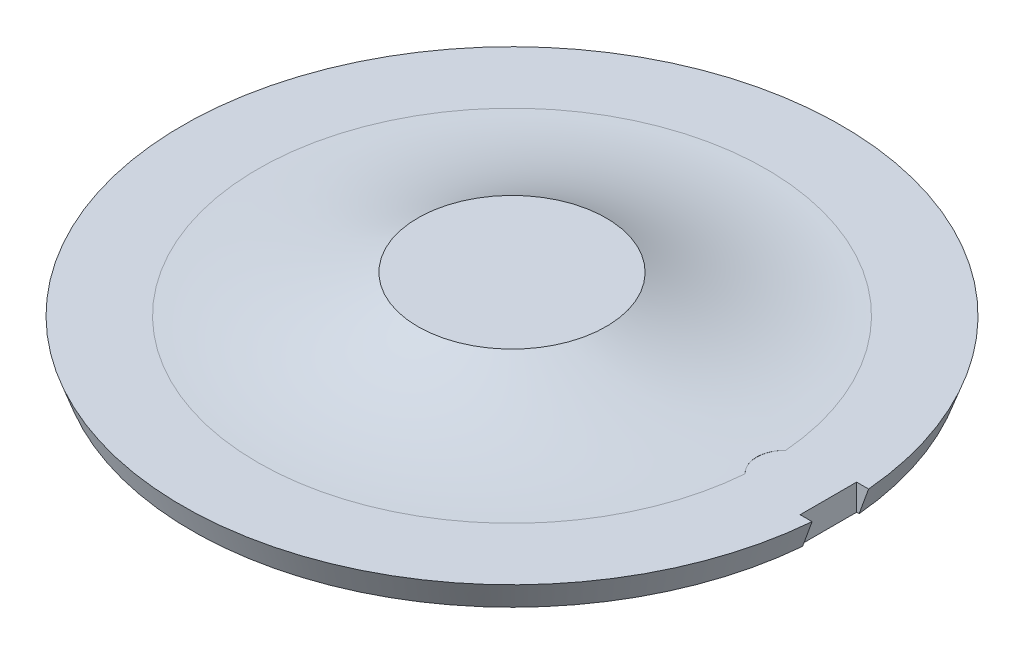
ISO-10303-21;
HEADER;
FILE_DESCRIPTION(('STEP AP214'),'2;1');
FILE_NAME('part.step','',(''),(''),'','','');
FILE_SCHEMA(('AUTOMOTIVE_DESIGN { 1 0 10303 214 1 1 1 1 }'));
ENDSEC;
DATA;
#1=APPLICATION_CONTEXT('core data for automotive mechanical design processes');
#2=APPLICATION_PROTOCOL_DEFINITION('international standard','automotive_design',2000,#1);
#3=PRODUCT_CONTEXT('',#1,'mechanical');
#4=PRODUCT('Part','Part','',(#3));
#5=PRODUCT_RELATED_PRODUCT_CATEGORY('part','',(#4));
#6=PRODUCT_DEFINITION_FORMATION('','',#4);
#7=PRODUCT_DEFINITION_CONTEXT('part definition',#1,'design');
#8=PRODUCT_DEFINITION('design','',#6,#7);
#9=PRODUCT_DEFINITION_SHAPE('','',#8);
#10=(LENGTH_UNIT() NAMED_UNIT(*) SI_UNIT(.MILLI.,.METRE.));
#11=(NAMED_UNIT(*) PLANE_ANGLE_UNIT() SI_UNIT($,.RADIAN.));
#12=(NAMED_UNIT(*) SI_UNIT($,.STERADIAN.) SOLID_ANGLE_UNIT());
#13=UNCERTAINTY_MEASURE_WITH_UNIT(LENGTH_MEASURE(1.E-05),#10,'distance_accuracy_value','');
#14=(GEOMETRIC_REPRESENTATION_CONTEXT(3) GLOBAL_UNCERTAINTY_ASSIGNED_CONTEXT((#13)) GLOBAL_UNIT_ASSIGNED_CONTEXT((#10,
#11,#12)) REPRESENTATION_CONTEXT('',''));
#15=CARTESIAN_POINT('',(0.,0.,0.));
#16=DIRECTION('',(0.,0.,1.));
#17=DIRECTION('',(1.,0.,0.));
#18=AXIS2_PLACEMENT_3D('',#15,#16,#17);
#19=CARTESIAN_POINT('',(0.,-431.799617416666,0.));
#20=DIRECTION('',(0.,1.,0.));
#21=DIRECTION('',(0.,0.,1.));
#22=AXIS2_PLACEMENT_3D('',#19,#20,#21);
#23=DEGENERATE_TOROIDAL_SURFACE('',#22,292.099904354144,431.799617416666,.T.);
#24=CARTESIAN_POINT('',(0.,-50.8,0.));
#25=DIRECTION('',(0.,1.,0.));
#26=DIRECTION('',(0.,0.,1.));
#27=AXIS2_PLACEMENT_3D('',#24,#25,#26);
#28=CIRCLE('',#27,88.9);
#29=CARTESIAN_POINT('',(0.,-50.8,88.9));
#30=VERTEX_POINT('',#29);
#31=EDGE_CURVE('E242',#30,#30,#28,.T.);
#32=ORIENTED_EDGE('',*,*,#31,.T.);
#33=EDGE_LOOP('',(#32));
#34=FACE_BOUND('',#33,.T.);
#35=CARTESIAN_POINT('',(343.153462992408,-3.28509972895805,38.1));
#36=CARTESIAN_POINT('',(338.701467969945,-2.73612243698974,38.1));
#37=CARTESIAN_POINT('',(334.241005320827,-2.2558780770424,38.1));
#38=CARTESIAN_POINT('',(325.307426552279,-1.43299467295321,38.1));
#39=CARTESIAN_POINT('',(320.834310497118,-1.09035493115061,38.1));
#40=CARTESIAN_POINT('',(311.896316504674,-0.54383303313131,38.1));
#41=CARTESIAN_POINT('',(307.431469818942,-0.339439458884335,38.1));
#42=CARTESIAN_POINT('',(298.497618278462,-0.067295956164065,38.1));
#43=CARTESIAN_POINT('',(294.028613425756,0.00045403939327902,38.1));
#44=CARTESIAN_POINT('',(285.090781160922,-0.000458601069057031,38.1));
#45=CARTESIAN_POINT('',(280.621953748168,-0.0691163540137956,38.1));
#46=CARTESIAN_POINT('',(271.688450372767,-0.342417936377009,38.1));
#47=CARTESIAN_POINT('',(267.22377442164,-0.547062142041295,38.1));
#48=CARTESIAN_POINT('',(258.286030273747,-1.09276553446646,38.1));
#49=CARTESIAN_POINT('',(253.812993037128,-1.43433149496253,38.1));
#50=CARTESIAN_POINT('',(244.879366844338,-2.25301253782263,38.1));
#51=CARTESIAN_POINT('',(240.418777808328,-2.73012674880408,38.1));
#52=CARTESIAN_POINT('',(235.966441361736,-3.27458630595173,38.1));
#53=B_SPLINE_CURVE_WITH_KNOTS('',3,(#35,#36,#37,#38,#39,#40,#41,#42,#43,#44,#45,#46,#47,#48,#49,
#50,#51,#52),.UNSPECIFIED.,.F.,.F.,(4,2,2,2,2,2,2,2,4),(0.,13.4565994474141,26.9131306684868,
40.3196054312072,53.7260736121267,67.1320618818241,80.5380872432158,93.9941958980604,
107.450218051209),.UNSPECIFIED.);
#54=CARTESIAN_POINT('',(289.604461505171,0.,38.1));
#55=VERTEX_POINT('',#54);
#56=CARTESIAN_POINT('',(287.02,-0.00760173721241902,38.1));
#57=VERTEX_POINT('',#56);
#58=EDGE_CURVE('E11',#55,#57,#53,.T.);
#59=ORIENTED_EDGE('',*,*,#58,.F.);
#60=CARTESIAN_POINT('',(0.,0.,0.));
#61=DIRECTION('',(0.,1.,0.));
#62=DIRECTION('',(0.,0.,1.));
#63=AXIS2_PLACEMENT_3D('',#60,#61,#62);
#64=CIRCLE('',#63,292.099904354144);
#65=CARTESIAN_POINT('',(289.604461505171,0.,-38.1));
#66=VERTEX_POINT('',#65);
#67=EDGE_CURVE('E121',#66,#55,#64,.T.);
#68=ORIENTED_EDGE('',*,*,#67,.F.);
#69=CARTESIAN_POINT('',(235.966441361736,-3.27458630595175,-38.1));
#70=CARTESIAN_POINT('',(240.418777808328,-2.73012674880411,-38.1));
#71=CARTESIAN_POINT('',(244.879366844338,-2.25301253782264,-38.1));
#72=CARTESIAN_POINT('',(253.812993037128,-1.4343314949625,-38.1));
#73=CARTESIAN_POINT('',(258.286030273747,-1.09276553446643,-38.1));
#74=CARTESIAN_POINT('',(267.22377442164,-0.547062142041286,-38.1));
#75=CARTESIAN_POINT('',(271.688450372767,-0.342417936377036,-38.1));
#76=CARTESIAN_POINT('',(280.621953748168,-0.0691163540138175,-38.1));
#77=CARTESIAN_POINT('',(285.090781160922,-0.000458601069039103,-38.1));
#78=CARTESIAN_POINT('',(294.028613425756,0.00045403939332354,-38.1));
#79=CARTESIAN_POINT('',(298.497618278462,-0.0672959561640331,-38.1));
#80=CARTESIAN_POINT('',(307.431469818942,-0.339439458884317,-38.1));
#81=CARTESIAN_POINT('',(311.896316504674,-0.543833033131294,-38.1));
#82=CARTESIAN_POINT('',(320.834310497118,-1.0903549311506,-38.1));
#83=CARTESIAN_POINT('',(325.307426552279,-1.43299467295321,-38.1));
#84=CARTESIAN_POINT('',(334.241005320827,-2.25587807704242,-38.1));
#85=CARTESIAN_POINT('',(338.701467969945,-2.73612243698976,-38.1));
#86=CARTESIAN_POINT('',(343.153462992408,-3.28509972895809,-38.1));
#87=B_SPLINE_CURVE_WITH_KNOTS('',3,(#69,#70,#71,#72,#73,#74,#75,#76,#77,#78,#79,#80,#81,#82,#83,
#84,#85,#86),.UNSPECIFIED.,.F.,.F.,(4,2,2,2,2,2,2,2,4),(0.,13.456022153149,26.9121308079936,
40.3181561693852,53.7241444390827,67.1306126200021,80.5370873827225,93.9936186037953,
107.450218051209),.UNSPECIFIED.);
#88=CARTESIAN_POINT('',(287.02,-0.00760173721248147,-38.1));
#89=VERTEX_POINT('',#88);
#90=EDGE_CURVE('E192',#89,#66,#87,.T.);
#91=ORIENTED_EDGE('',*,*,#90,.F.);
#92=CARTESIAN_POINT('',(287.0202,-0.00760056080961184,38.0999999994751));
#93=CARTESIAN_POINT('',(286.48551485532,-0.0107441003588245,38.1000035838872));
#94=CARTESIAN_POINT('',(285.950895137473,-0.0148748883079851,38.0887488058366));
#95=CARTESIAN_POINT('',(284.882634631054,-0.0251242691452786,38.0437577117675));
#96=CARTESIAN_POINT('',(284.348993819012,-0.031242813733873,38.0100219419828));
#97=CARTESIAN_POINT('',(282.751062580791,-0.0525964717974353,37.8751695568477));
#98=CARTESIAN_POINT('',(281.689471607957,-0.0708313051753749,37.7404078263647));
#99=CARTESIAN_POINT('',(279.582485682996,-0.115170537555716,37.3822724124333));
#100=CARTESIAN_POINT('',(278.537077157115,-0.141267918099529,37.1589777015077));
#101=CARTESIAN_POINT('',(276.986243981392,-0.186042734668606,36.758930597817));
#102=CARTESIAN_POINT('',(276.472158009328,-0.201906592928936,36.6147231991849));
#103=CARTESIAN_POINT('',(275.450421191637,-0.235448216459894,36.3048194297707));
#104=CARTESIAN_POINT('',(274.942772017015,-0.253126442334039,36.1391175994841));
#105=CARTESIAN_POINT('',(273.430815397182,-0.308771695282392,35.610168239769));
#106=CARTESIAN_POINT('',(272.437551950085,-0.349347755150277,35.2150905451208));
#107=CARTESIAN_POINT('',(270.487945247207,-0.436640000420907,34.3429982392917));
#108=CARTESIAN_POINT('',(269.531602124991,-0.483356208034014,33.8659833317226));
#109=CARTESIAN_POINT('',(268.130017960203,-0.557244580522501,33.0917476318044));
#110=CARTESIAN_POINT('',(267.668263976677,-0.582512624914469,32.8238516769617));
#111=CARTESIAN_POINT('',(266.756553413389,-0.634169270013296,32.2689843869327));
#112=CARTESIAN_POINT('',(266.306593840746,-0.660557581906963,31.9820179575976));
#113=CARTESIAN_POINT('',(265.41912396996,-0.71430432662279,31.3894387307748));
#114=CARTESIAN_POINT('',(264.981614820898,-0.741662848468103,31.0838242203393));
#115=CARTESIAN_POINT('',(264.11984579738,-0.797177814697518,30.4545189345757));
#116=CARTESIAN_POINT('',(263.695586819114,-0.825334312809007,30.1308269406677));
#117=CARTESIAN_POINT('',(262.441595721329,-0.910887134604656,29.1316994401829));
#118=CARTESIAN_POINT('',(261.632846844378,-0.969232454361403,28.4296797161056));
#119=CARTESIAN_POINT('',(260.077430809286,-1.08687858068017,26.9602124950047));
#120=CARTESIAN_POINT('',(259.33076387247,-1.14617939064769,26.1927647647451));
#121=CARTESIAN_POINT('',(257.904479429744,-1.2641246286467,24.5975848744863));
#122=CARTESIAN_POINT('',(257.224872771902,-1.32276894912471,23.7698429984692));
#123=CARTESIAN_POINT('',(255.937667045053,-1.437717081683,22.0600036264293));
#124=CARTESIAN_POINT('',(255.330068014798,-1.49402089250367,21.1779061011541));
#125=CARTESIAN_POINT('',(254.189757654903,-1.60276492643469,19.3632718694997));
#126=CARTESIAN_POINT('',(253.657235518418,-1.6551952356661,18.430615656104));
#127=CARTESIAN_POINT('',(252.672694957362,-1.75444024585777,16.5234468406268));
#128=CARTESIAN_POINT('',(252.220676707998,-1.80125493459621,15.5489341474551));
#129=CARTESIAN_POINT('',(251.400459987005,-1.88780173522251,13.5650434379355));
#130=CARTESIAN_POINT('',(251.032254119941,-1.92753447194038,12.5556685068205));
#131=CARTESIAN_POINT('',(250.382313621859,-1.99865347864455,10.509165967111));
#132=CARTESIAN_POINT('',(250.100578595434,-2.03003978679664,9.47203848544467));
#133=CARTESIAN_POINT('',(249.626617612577,-2.08333920850104,7.38166173292551));
#134=CARTESIAN_POINT('',(249.434037613108,-2.10528976703059,6.32849368729791));
#135=CARTESIAN_POINT('',(249.138154310253,-2.13918277881166,4.20953004145422));
#136=CARTESIAN_POINT('',(249.034850794257,-2.15112525589714,3.14373447131634));
#137=CARTESIAN_POINT('',(248.918291134887,-2.16460874375805,1.00717252661733));
#138=CARTESIAN_POINT('',(248.905034345201,-2.16614982918986,-0.0635938122107403));
#139=CARTESIAN_POINT('',(248.968665744336,-2.15877975710154,-2.20240661793969));
#140=CARTESIAN_POINT('',(249.045553684801,-2.14986862837827,-3.27045309232594));
#141=CARTESIAN_POINT('',(249.288287530073,-2.12195865289757,-5.39081417630183));
#142=CARTESIAN_POINT('',(249.453684818834,-2.10301068346336,-6.44318085076265));
#143=CARTESIAN_POINT('',(249.871933457106,-2.05567329993919,-8.53016759209981));
#144=CARTESIAN_POINT('',(250.124784478574,-2.0272839212644,-9.56478772552897));
#145=CARTESIAN_POINT('',(250.716098702924,-1.96197337161338,-11.6090002443067));
#146=CARTESIAN_POINT('',(251.054562958555,-1.92505209572458,-12.6185923217285));
#147=CARTESIAN_POINT('',(251.814656690673,-1.84384260835358,-14.6056620163114));
#148=CARTESIAN_POINT('',(252.236286476837,-1.79955436943972,-15.5831395138742));
#149=CARTESIAN_POINT('',(253.160877952716,-1.70485915702528,-17.5016172819615));
#150=CARTESIAN_POINT('',(253.664044764925,-1.65443683392251,-18.4425179345175));
#151=CARTESIAN_POINT('',(254.747362712519,-1.54909316136106,-20.2786370522376));
#152=CARTESIAN_POINT('',(255.327513960306,-1.49417180533361,-21.1738554507004));
#153=CARTESIAN_POINT('',(256.560705766711,-1.3814515312457,-22.9123805975167));
#154=CARTESIAN_POINT('',(257.213745192355,-1.3236526579211,-23.7556881524562));
#155=CARTESIAN_POINT('',(258.588155440645,-1.20682971810495,-25.3845579002404));
#156=CARTESIAN_POINT('',(259.309526394265,-1.14780564926521,-26.1701199823975));
#157=CARTESIAN_POINT('',(260.819766154762,-1.02983596606175,-27.682230541722));
#158=CARTESIAN_POINT('',(261.608987414917,-0.970892605951953,-28.4084272275404));
#159=CARTESIAN_POINT('',(263.245916774712,-0.854997997647866,-29.7917991476628));
#160=CARTESIAN_POINT('',(264.093625533874,-0.798046771928389,-30.448973603441));
#161=CARTESIAN_POINT('',(265.84184210822,-0.687581621194061,-31.6898244666834));
#162=CARTESIAN_POINT('',(266.742366299122,-0.634068773159701,-32.2734779000915));
#163=CARTESIAN_POINT('',(268.589600750556,-0.531804499161623,-33.362854912755));
#164=CARTESIAN_POINT('',(269.536309549311,-0.483052922646616,-33.8685809563648));
#165=CARTESIAN_POINT('',(271.469706933423,-0.391398601644547,-34.7987033446281));
#166=CARTESIAN_POINT('',(272.456414624717,-0.348498696015655,-35.2230602543765));
#167=CARTESIAN_POINT('',(274.462505760612,-0.269468325799958,-35.9871008220374));
#168=CARTESIAN_POINT('',(275.481893227046,-0.233338698192003,-36.3267740125976));
#169=CARTESIAN_POINT('',(277.544509146937,-0.168566136911105,-36.9184901087975));
#170=CARTESIAN_POINT('',(278.587704270925,-0.139913360583978,-37.1706483664619));
#171=CARTESIAN_POINT('',(280.691514245639,-0.0904687810568058,-37.5860191005269));
#172=CARTESIAN_POINT('',(281.752120393761,-0.0696731683480214,-37.7492746979508));
#173=CARTESIAN_POINT('',(283.166549585734,-0.0473991224455872,-37.9062592743643));
#174=CARTESIAN_POINT('',(283.516190980845,-0.0423327587692731,-37.9401735290678));
#175=CARTESIAN_POINT('',(284.216234372943,-0.0330620201763976,-37.9983180421599));
#176=CARTESIAN_POINT('',(284.566636188287,-0.0288574583269226,-38.0225504017274));
#177=CARTESIAN_POINT('',(285.267390188753,-0.0213151002719598,-38.061283532866));
#178=CARTESIAN_POINT('',(285.617741466743,-0.017975858606058,-38.0758005982528));
#179=CARTESIAN_POINT('',(286.318793395486,-0.0121496909028008,-38.095161286356));
#180=CARTESIAN_POINT('',(286.669494105004,-0.00966294759875814,-38.1000028361951));
#181=CARTESIAN_POINT('',(287.0202,-0.0076005608095375,-38.0999999994751));
#182=B_SPLINE_CURVE_WITH_KNOTS('',3,(#92,#93,#94,#95,#96,#97,#98,#99,#100,#101,#102,#103,#104,
#105,#106,#107,#108,#109,#110,#111,#112,#113,#114,#115,#116,#117,#118,#119,#120,#121,#122,#123,
#124,#125,#126,#127,#128,#129,#130,#131,#132,#133,#134,#135,#136,#137,#138,#139,#140,#141,#142,
#143,#144,#145,#146,#147,#148,#149,#150,#151,#152,#153,#154,#155,#156,#157,#158,#159,#160,#161,
#162,#163,#164,#165,#166,#167,#168,#169,#170,#171,#172,#173,#174,#175,#176,#177,#178,#179,#180,
#181),.UNSPECIFIED.,.F.,.F.,(4,2,2,2,2,2,2,2,2,2,2,2,2,2,2,2,2,2,2,2,2,2,2,2,2,2,2,2,2,2,2,2,2,
2,2,2,2,2,2,2,2,2,2,2,4),(0.,1.6038446238825,3.20765027963353,6.41438919664786,9.61827407488848,
11.2203529137821,12.8228394743664,16.0279766284307,19.2331253765513,20.8360430749064,
22.4385500094302,24.0412043669206,25.6439668879796,28.8574038814388,32.0708523305436,
35.2848197568765,38.4987889128715,41.7207177658796,44.9426536309586,48.164305088598,
51.3859418143131,54.5946729957936,57.80339653575,61.0120970449508,64.2207887138885,
67.413368836513,70.6059369837534,73.7985443905289,76.991163685581,80.1919430217088,
83.3927270311928,86.5934612946217,89.7942016931225,93.0127094408556,96.2312534873614,
99.4508007917279,102.670246261106,105.891248087262,109.11264784898,112.329785264339,
115.545360858037,116.599232701272,117.652875707324,118.704747158309,119.756843937525),.UNSPECIFIED.);
#183=EDGE_CURVE('E50',#57,#89,#182,.T.);
#184=ORIENTED_EDGE('',*,*,#183,.F.);
#185=EDGE_LOOP('',(#59,#68,#91,#184));
#186=FACE_BOUND('',#185,.T.);
#187=ADVANCED_FACE('F37',(#34,#186),#23,.F.);
#188=CARTESIAN_POINT('',(0.,519.439779458135,0.));
#189=DIRECTION('',(0.,1.,0.));
#190=DIRECTION('',(0.,0.,1.));
#191=AXIS2_PLACEMENT_3D('',#188,#189,#190);
#192=DEGENERATE_TOROIDAL_SURFACE('',#191,342.9,484.1875,.T.);
#193=CARTESIAN_POINT('',(0.,86.0522794581347,0.));
#194=DIRECTION('',(0.,1.,0.));
#195=DIRECTION('',(0.,0.,1.));
#196=AXIS2_PLACEMENT_3D('',#193,#194,#195);
#197=CIRCLE('',#196,127.);
#198=CARTESIAN_POINT('',(0.,86.0522794581347,127.));
#199=VERTEX_POINT('',#198);
#200=EDGE_CURVE('E238',#199,#199,#197,.T.);
#201=ORIENTED_EDGE('',*,*,#200,.F.);
#202=EDGE_LOOP('',(#201));
#203=FACE_BOUND('',#202,.T.);
#204=CARTESIAN_POINT('',(342.9002,35.2537030642755,-28.3982421984179));
#205=CARTESIAN_POINT('',(342.500868964281,35.252666019522,-28.0410756579489));
#206=CARTESIAN_POINT('',(342.109117180745,35.2522138549873,-27.6755232849541));
#207=CARTESIAN_POINT('',(341.341382860437,35.2523602842911,-26.9282371544691));
#208=CARTESIAN_POINT('',(340.965399930131,35.2529588518912,-26.5465038012757));
#209=CARTESIAN_POINT('',(339.862186366715,35.2561515642435,-25.3780970292816));
#210=CARTESIAN_POINT('',(339.159478344765,35.2601422945238,-24.5680266808265));
#211=CARTESIAN_POINT('',(337.825386181317,35.270839342606,-22.8922264068715));
#212=CARTESIAN_POINT('',(337.193945176737,35.2775434755458,-22.0265417333405));
#213=CARTESIAN_POINT('',(336.303278273173,35.2888674962815,-20.6907329324661));
#214=CARTESIAN_POINT('',(336.015794224098,35.2928536667618,-20.2392300255269));
#215=CARTESIAN_POINT('',(335.460024793748,35.3011251893588,-19.3244029146099));
#216=CARTESIAN_POINT('',(335.191744349736,35.3054106178596,-18.8610757118349));
#217=CARTESIAN_POINT('',(334.416420877457,35.3185311999799,-17.4544912540561));
#218=CARTESIAN_POINT('',(333.938959743875,35.3276297855313,-16.4947272105934));
#219=CARTESIAN_POINT('',(333.066597094005,35.3455923724389,-14.5383757756456));
#220=CARTESIAN_POINT('',(332.671695582442,35.3544563737816,-13.5417883820532));
#221=CARTESIAN_POINT('',(332.143398717973,35.366960055252,-12.0248571302278));
#222=CARTESIAN_POINT('',(331.977960149941,35.370996318967,-11.5154778301046));
#223=CARTESIAN_POINT('',(331.66872738852,35.3787165166139,-10.4902987058236));
#224=CARTESIAN_POINT('',(331.524927665155,35.3824005404754,-9.97450055865912));
#225=CARTESIAN_POINT('',(331.259182242483,35.3893368680375,-8.93725160431099));
#226=CARTESIAN_POINT('',(331.137238513432,35.3925891328093,-8.41580029199914));
#227=CARTESIAN_POINT('',(330.915429216718,35.398593410564,-7.36821857087422));
#228=CARTESIAN_POINT('',(330.815565127622,35.4013453900429,-6.84208785115636));
#229=CARTESIAN_POINT('',(330.549352992258,35.4087611401688,-5.25785542040766));
#230=CARTESIAN_POINT('',(330.416389617351,35.4125846001249,-4.1939311634787));
#231=CARTESIAN_POINT('',(330.240583352756,35.4176698729362,-2.05879988295945));
#232=CARTESIAN_POINT('',(330.197740680958,35.4189316795979,-0.987592841767467));
#233=CARTESIAN_POINT('',(330.202442482451,35.4187939443009,1.15466787793758));
#234=CARTESIAN_POINT('',(330.249987509316,35.4173943860428,2.2257215554712));
#235=CARTESIAN_POINT('',(330.435137018689,35.4120463849579,4.35999648215259));
#236=CARTESIAN_POINT('',(330.572741244471,35.408097949397,5.42321775361912));
#237=CARTESIAN_POINT('',(330.936945264884,35.3979775711276,7.53381972083556));
#238=CARTESIAN_POINT('',(331.163506165733,35.391806600257,8.58120713193282));
#239=CARTESIAN_POINT('',(331.704015552091,35.3777582171454,10.6531799487229));
#240=CARTESIAN_POINT('',(332.017964590193,35.3698807941139,11.6777652101838));
#241=CARTESIAN_POINT('',(332.731053844797,35.3531076233798,13.6969554415929));
#242=CARTESIAN_POINT('',(333.130202637562,35.3442117732036,14.6915573818897));
#243=CARTESIAN_POINT('',(334.010830833304,35.326232534249,16.6435980941044));
#244=CARTESIAN_POINT('',(334.492308783095,35.3171491487834,17.6010375216095));
#245=CARTESIAN_POINT('',(335.527397521497,35.2998430508717,19.4597866302396));
#246=CARTESIAN_POINT('',(336.079987115127,35.2916106692963,20.3616649643805));
#247=CARTESIAN_POINT('',(337.258195983658,35.2768342387863,22.1163590286984));
#248=CARTESIAN_POINT('',(337.883815123776,35.2702901867358,22.9691748494198));
#249=CARTESIAN_POINT('',(339.204334534483,35.2598698423728,24.6205264409481));
#250=CARTESIAN_POINT('',(339.899282206642,35.2559953898397,25.4190244372383));
#251=CARTESIAN_POINT('',(340.989537701696,35.2529148926831,26.5711983636343));
#252=CARTESIAN_POINT('',(341.360983543118,35.2523433678289,26.9477100426805));
#253=CARTESIAN_POINT('',(342.119223800925,35.2522256383707,27.6849507765355));
#254=CARTESIAN_POINT('',(342.506018277425,35.252679437783,28.045679769518));
#255=CARTESIAN_POINT('',(342.9002,35.2537030642754,28.3982421984179));
#256=B_SPLINE_CURVE_WITH_KNOTS('',3,(#204,#205,#206,#207,#208,#209,#210,#211,#212,#213,#214,
#215,#216,#217,#218,#219,#220,#221,#222,#223,#224,#225,#226,#227,#228,#229,#230,#231,#232,#233,
#234,#235,#236,#237,#238,#239,#240,#241,#242,#243,#244,#245,#246,#247,#248,#249,#250,#251,#252,
#253,#254,#255),.UNSPECIFIED.,.F.,.F.,(4,2,2,2,2,2,2,2,2,2,2,2,2,2,2,2,2,2,2,2,2,2,2,2,2,4),(0.,
1.6070284813474,3.21401683324051,6.42714046301271,9.63768198086342,11.2430871126044,
12.8489035237646,16.0608815744868,19.2728598090172,20.8792226034637,22.4851741794799,
24.0912704548464,25.6974742502032,28.909936560547,32.122406637824,35.3348963897066,
38.547376983929,41.7584545733642,44.9695524682719,48.1809737469296,51.3923383468487,
54.5618756161637,57.7314070359436,60.9031205889523,62.4894188563492,64.0757233372661),.UNSPECIFIED.);
#257=CARTESIAN_POINT('',(341.805172413793,35.2522794581348,-27.379446874931));
#258=VERTEX_POINT('',#257);
#259=CARTESIAN_POINT('',(341.805172413793,35.2522794581348,27.379446874931));
#260=VERTEX_POINT('',#259);
#261=EDGE_CURVE('E185',#258,#260,#256,.T.);
#262=ORIENTED_EDGE('',*,*,#261,.F.);
#263=CARTESIAN_POINT('',(0.,35.2522794581348,0.));
#264=DIRECTION('',(0.,1.,0.));
#265=DIRECTION('',(0.,0.,1.));
#266=AXIS2_PLACEMENT_3D('',#263,#264,#265);
#267=CIRCLE('',#266,342.9);
#268=EDGE_CURVE('E244',#258,#260,#267,.T.);
#269=ORIENTED_EDGE('',*,*,#268,.T.);
#270=EDGE_LOOP('',(#262,#269));
#271=FACE_BOUND('',#270,.T.);
#272=ADVANCED_FACE('F179',(#203,#271),#192,.F.);
#273=CARTESIAN_POINT('',(292.099904354144,0.,0.));
#274=DIRECTION('',(0.,1.,0.));
#275=DIRECTION('',(0.,0.,1.));
#276=AXIS2_PLACEMENT_3D('',#273,#274,#275);
#277=PLANE('',#276);
#278=ORIENTED_EDGE('',*,*,#67,.T.);
#279=DIRECTION('',(-1.,0.,0.));
#280=VECTOR('',#279,1.);
#281=CARTESIAN_POINT('',(426.72,0.,38.1));
#282=LINE('',#281,#280);
#283=CARTESIAN_POINT('',(287.02,0.,38.1));
#284=VERTEX_POINT('',#283);
#285=EDGE_CURVE('E110',#55,#284,#282,.T.);
#286=ORIENTED_EDGE('',*,*,#285,.T.);
#287=CARTESIAN_POINT('',(287.02,0.,0.));
#288=DIRECTION('',(0.,-1.,0.));
#289=DIRECTION('',(0.,0.,1.));
#290=AXIS2_PLACEMENT_3D('',#287,#288,#289);
#291=CIRCLE('',#290,38.1);
#292=CARTESIAN_POINT('',(287.02,0.,-38.1));
#293=VERTEX_POINT('',#292);
#294=EDGE_CURVE('E119',#284,#293,#291,.T.);
#295=ORIENTED_EDGE('',*,*,#294,.T.);
#296=DIRECTION('',(1.,0.,0.));
#297=VECTOR('',#296,1.);
#298=CARTESIAN_POINT('',(426.72,0.,-38.1));
#299=LINE('',#298,#297);
#300=EDGE_CURVE('E57',#293,#66,#299,.T.);
#301=ORIENTED_EDGE('',*,*,#300,.T.);
#302=EDGE_LOOP('',(#278,#286,#295,#301));
#303=FACE_BOUND('',#302,.T.);
#304=DIRECTION('',(0.,0.,-1.));
#305=VECTOR('',#304,1.);
#306=CARTESIAN_POINT('',(426.72,0.,38.1));
#307=LINE('',#306,#305);
#308=CARTESIAN_POINT('',(426.72,0.,38.1));
#309=VERTEX_POINT('',#308);
#310=CARTESIAN_POINT('',(426.72,0.,-38.1));
#311=VERTEX_POINT('',#310);
#312=EDGE_CURVE('E137',#309,#311,#307,.T.);
#313=ORIENTED_EDGE('',*,*,#312,.F.);
#314=DIRECTION('',(-1.,0.,0.));
#315=VECTOR('',#314,1.);
#316=CARTESIAN_POINT('',(444.5,0.,38.1));
#317=LINE('',#316,#315);
#318=CARTESIAN_POINT('',(430.115737215285,0.,38.1));
#319=VERTEX_POINT('',#318);
#320=EDGE_CURVE('E142',#319,#309,#317,.T.);
#321=ORIENTED_EDGE('',*,*,#320,.F.);
#322=CARTESIAN_POINT('',(0.,0.,0.));
#323=DIRECTION('',(0.,1.,0.));
#324=DIRECTION('',(0.,0.,1.));
#325=AXIS2_PLACEMENT_3D('',#322,#323,#324);
#326=CIRCLE('',#325,431.799904354144);
#327=CARTESIAN_POINT('',(430.115737215285,0.,-38.1));
#328=VERTEX_POINT('',#327);
#329=EDGE_CURVE('E233',#328,#319,#326,.T.);
#330=ORIENTED_EDGE('',*,*,#329,.F.);
#331=DIRECTION('',(-1.,0.,0.));
#332=VECTOR('',#331,1.);
#333=CARTESIAN_POINT('',(444.5,0.,-38.1));
#334=LINE('',#333,#332);
#335=EDGE_CURVE('E139',#328,#311,#334,.T.);
#336=ORIENTED_EDGE('',*,*,#335,.T.);
#337=EDGE_LOOP('',(#313,#321,#330,#336));
#338=FACE_BOUND('',#337,.T.);
#339=ADVANCED_FACE('F117',(#303,#338),#277,.F.);
#340=CARTESIAN_POINT('',(0.,0.,0.));
#341=DIRECTION('',(0.,1.,0.));
#342=DIRECTION('',(0.,0.,1.));
#343=AXIS2_PLACEMENT_3D('',#340,#341,#342);
#344=CONICAL_SURFACE('',#343,431.799904354144,0.345788479528455);
#345=CARTESIAN_POINT('',(404.988894502227,-69.4570083942744,-38.1));
#346=CARTESIAN_POINT('',(409.432885719869,-57.1758239636069,-38.1));
#347=CARTESIAN_POINT('',(413.876313871176,-44.8944357951854,-38.1));
#348=CARTESIAN_POINT('',(422.762139227588,-20.3312865892732,-38.1));
#349=CARTESIAN_POINT('',(427.2045364327,-8.04952555178476,-38.1));
#350=CARTESIAN_POINT('',(436.088395131036,16.514334918045,-38.1));
#351=CARTESIAN_POINT('',(440.529856624262,28.7964343503859,-38.1));
#352=CARTESIAN_POINT('',(449.411922997056,53.3609430332055,-38.1));
#353=CARTESIAN_POINT('',(453.852527876619,65.6433522836859,-38.1));
#354=CARTESIAN_POINT('',(458.292743970147,77.9259020765642,-38.1));
#355=B_SPLINE_CURVE_WITH_KNOTS('',3,(#345,#346,#347,#348,#349,#350,#351,#352,#353,#354),
.UNSPECIFIED.,.F.,.F.,(4,2,2,2,4),(0.,39.1814871915662,78.3629741527055,117.544461074829,
156.725948227277),.UNSPECIFIED.);
#356=CARTESIAN_POINT('',(442.864132663733,35.2522794581348,-38.1));
#357=VERTEX_POINT('',#356);
#358=EDGE_CURVE('E152',#328,#357,#355,.T.);
#359=ORIENTED_EDGE('',*,*,#358,.F.);
#360=ORIENTED_EDGE('',*,*,#329,.T.);
#361=CARTESIAN_POINT('',(458.292743970147,77.9259020765642,38.1));
#362=CARTESIAN_POINT('',(453.852527876619,65.6433522836859,38.1));
#363=CARTESIAN_POINT('',(449.411922997056,53.3609430332054,38.1));
#364=CARTESIAN_POINT('',(440.529856624262,28.7964343503859,38.1));
#365=CARTESIAN_POINT('',(436.088395131036,16.5143349180449,38.1));
#366=CARTESIAN_POINT('',(427.2045364327,-8.04952555178478,38.1));
#367=CARTESIAN_POINT('',(422.762139227588,-20.3312865892732,38.1));
#368=CARTESIAN_POINT('',(413.876313871176,-44.8944357951854,38.1));
#369=CARTESIAN_POINT('',(409.432885719869,-57.1758239636069,38.1));
#370=CARTESIAN_POINT('',(404.988894502227,-69.4570083942744,38.1));
#371=B_SPLINE_CURVE_WITH_KNOTS('',3,(#361,#362,#363,#364,#365,#366,#367,#368,#369,#370),
.UNSPECIFIED.,.F.,.F.,(4,2,2,2,4),(0.,39.1814871524487,78.362974074572,117.544461035711,
156.725948227277),.UNSPECIFIED.);
#372=CARTESIAN_POINT('',(442.864132663733,35.2522794581348,38.1));
#373=VERTEX_POINT('',#372);
#374=EDGE_CURVE('E144',#373,#319,#371,.T.);
#375=ORIENTED_EDGE('',*,*,#374,.F.);
#376=CARTESIAN_POINT('',(0.,35.2522794581348,0.));
#377=DIRECTION('',(0.,1.,0.));
#378=DIRECTION('',(0.,0.,1.));
#379=AXIS2_PLACEMENT_3D('',#376,#377,#378);
#380=CIRCLE('',#379,444.5);
#381=EDGE_CURVE('E235',#357,#373,#380,.T.);
#382=ORIENTED_EDGE('',*,*,#381,.F.);
#383=EDGE_LOOP('',(#359,#360,#375,#382));
#384=FACE_BOUND('',#383,.T.);
#385=ADVANCED_FACE('F159',(#384),#344,.T.);
#386=CARTESIAN_POINT('',(342.9,35.2522794581348,0.));
#387=DIRECTION('',(0.,-1.,0.));
#388=DIRECTION('',(0.,0.,-1.));
#389=AXIS2_PLACEMENT_3D('',#386,#387,#388);
#390=PLANE('',#389);
#391=ORIENTED_EDGE('',*,*,#268,.F.);
#392=CARTESIAN_POINT('',(368.3,35.2522794581348,0.));
#393=DIRECTION('',(0.,1.,0.));
#394=DIRECTION('',(0.,0.,-1.));
#395=AXIS2_PLACEMENT_3D('',#392,#393,#394);
#396=CIRCLE('',#395,38.1);
#397=EDGE_CURVE('E64',#258,#260,#396,.T.);
#398=ORIENTED_EDGE('',*,*,#397,.T.);
#399=EDGE_LOOP('',(#391,#398));
#400=FACE_BOUND('',#399,.T.);
#401=DIRECTION('',(0.,0.,1.));
#402=VECTOR('',#401,1.);
#403=CARTESIAN_POINT('',(426.72,35.2522794581348,-38.1));
#404=LINE('',#403,#402);
#405=CARTESIAN_POINT('',(426.72,35.2522794581348,-38.1));
#406=VERTEX_POINT('',#405);
#407=CARTESIAN_POINT('',(426.72,35.2522794581348,38.1));
#408=VERTEX_POINT('',#407);
#409=EDGE_CURVE('E132',#406,#408,#404,.T.);
#410=ORIENTED_EDGE('',*,*,#409,.F.);
#411=DIRECTION('',(-1.,0.,0.));
#412=VECTOR('',#411,1.);
#413=CARTESIAN_POINT('',(342.9,35.2522794581348,-38.1));
#414=LINE('',#413,#412);
#415=EDGE_CURVE('E193',#357,#406,#414,.T.);
#416=ORIENTED_EDGE('',*,*,#415,.F.);
#417=ORIENTED_EDGE('',*,*,#381,.T.);
#418=DIRECTION('',(1.,0.,0.));
#419=VECTOR('',#418,1.);
#420=CARTESIAN_POINT('',(342.9,35.2522794581348,38.1));
#421=LINE('',#420,#419);
#422=EDGE_CURVE('E249',#408,#373,#421,.T.);
#423=ORIENTED_EDGE('',*,*,#422,.F.);
#424=EDGE_LOOP('',(#410,#416,#417,#423));
#425=FACE_BOUND('',#424,.T.);
#426=ADVANCED_FACE('F183',(#400,#425),#390,.F.);
#427=CARTESIAN_POINT('',(0.,-50.8,0.));
#428=DIRECTION('',(0.,1.,0.));
#429=DIRECTION('',(0.,0.,1.));
#430=AXIS2_PLACEMENT_3D('',#427,#428,#429);
#431=PLANE('',#430);
#432=ORIENTED_EDGE('',*,*,#31,.F.);
#433=EDGE_LOOP('',(#432));
#434=FACE_BOUND('',#433,.T.);
#435=ADVANCED_FACE('F39',(#434),#431,.F.);
#436=CARTESIAN_POINT('',(127.,86.0522794581347,0.));
#437=DIRECTION('',(0.,-1.,0.));
#438=DIRECTION('',(0.,0.,-1.));
#439=AXIS2_PLACEMENT_3D('',#436,#437,#438);
#440=PLANE('',#439);
#441=ORIENTED_EDGE('',*,*,#200,.T.);
#442=EDGE_LOOP('',(#441));
#443=FACE_BOUND('',#442,.T.);
#444=ADVANCED_FACE('F174',(#443),#440,.F.);
#445=CARTESIAN_POINT('',(444.5,0.,-38.1));
#446=DIRECTION('',(0.,0.,1.));
#447=DIRECTION('',(0.,-1.,0.));
#448=AXIS2_PLACEMENT_3D('',#445,#446,#447);
#449=PLANE('',#448);
#450=ORIENTED_EDGE('',*,*,#358,.T.);
#451=ORIENTED_EDGE('',*,*,#415,.T.);
#452=DIRECTION('',(0.,1.,0.));
#453=VECTOR('',#452,1.);
#454=CARTESIAN_POINT('',(426.72,0.,-38.1));
#455=LINE('',#454,#453);
#456=EDGE_CURVE('E130',#311,#406,#455,.T.);
#457=ORIENTED_EDGE('',*,*,#456,.F.);
#458=ORIENTED_EDGE('',*,*,#335,.F.);
#459=EDGE_LOOP('',(#450,#451,#457,#458));
#460=FACE_BOUND('',#459,.T.);
#461=ADVANCED_FACE('F168',(#460),#449,.T.);
#462=CARTESIAN_POINT('',(444.5,35.2522794581348,38.1));
#463=DIRECTION('',(0.,0.,-1.));
#464=DIRECTION('',(0.,1.,0.));
#465=AXIS2_PLACEMENT_3D('',#462,#463,#464);
#466=PLANE('',#465);
#467=ORIENTED_EDGE('',*,*,#374,.T.);
#468=ORIENTED_EDGE('',*,*,#320,.T.);
#469=DIRECTION('',(0.,-1.,0.));
#470=VECTOR('',#469,1.);
#471=CARTESIAN_POINT('',(426.72,35.2522794581348,38.1));
#472=LINE('',#471,#470);
#473=EDGE_CURVE('E134',#408,#309,#472,.T.);
#474=ORIENTED_EDGE('',*,*,#473,.F.);
#475=ORIENTED_EDGE('',*,*,#422,.T.);
#476=EDGE_LOOP('',(#467,#468,#474,#475));
#477=FACE_BOUND('',#476,.T.);
#478=ADVANCED_FACE('F163',(#477),#466,.T.);
#479=CARTESIAN_POINT('',(426.72,0.,0.));
#480=DIRECTION('',(1.,0.,0.));
#481=DIRECTION('',(0.,0.,-1.));
#482=AXIS2_PLACEMENT_3D('',#479,#480,#481);
#483=PLANE('',#482);
#484=ORIENTED_EDGE('',*,*,#456,.T.);
#485=ORIENTED_EDGE('',*,*,#409,.T.);
#486=ORIENTED_EDGE('',*,*,#473,.T.);
#487=ORIENTED_EDGE('',*,*,#312,.T.);
#488=EDGE_LOOP('',(#484,#485,#486,#487));
#489=FACE_BOUND('',#488,.T.);
#490=ADVANCED_FACE('F167',(#489),#483,.T.);
#491=CARTESIAN_POINT('',(368.3,86.0522794581347,0.));
#492=DIRECTION('',(0.,-1.,0.));
#493=DIRECTION('',(0.,0.,-1.));
#494=AXIS2_PLACEMENT_3D('',#491,#492,#493);
#495=CYLINDRICAL_SURFACE('',#494,38.1);
#496=ORIENTED_EDGE('',*,*,#261,.T.);
#497=ORIENTED_EDGE('',*,*,#397,.F.);
#498=EDGE_LOOP('',(#496,#497));
#499=FACE_BOUND('',#498,.T.);
#500=ADVANCED_FACE('F200',(#499),#495,.F.);
#501=CARTESIAN_POINT('',(426.72,-50.8,38.1));
#502=DIRECTION('',(0.,0.,-1.));
#503=DIRECTION('',(-1.,0.,0.));
#504=AXIS2_PLACEMENT_3D('',#501,#502,#503);
#505=PLANE('',#504);
#506=ORIENTED_EDGE('',*,*,#58,.T.);
#507=DIRECTION('',(0.,1.,0.));
#508=VECTOR('',#507,1.);
#509=CARTESIAN_POINT('',(287.02,-50.8,38.1));
#510=LINE('',#509,#508);
#511=EDGE_CURVE('E107',#57,#284,#510,.T.);
#512=ORIENTED_EDGE('',*,*,#511,.T.);
#513=ORIENTED_EDGE('',*,*,#285,.F.);
#514=EDGE_LOOP('',(#506,#512,#513));
#515=FACE_BOUND('',#514,.T.);
#516=ADVANCED_FACE('F109',(#515),#505,.T.);
#517=CARTESIAN_POINT('',(287.02,-50.8,0.));
#518=DIRECTION('',(0.,1.,0.));
#519=DIRECTION('',(0.,0.,1.));
#520=AXIS2_PLACEMENT_3D('',#517,#518,#519);
#521=CYLINDRICAL_SURFACE('',#520,38.1);
#522=ORIENTED_EDGE('',*,*,#183,.T.);
#523=DIRECTION('',(0.,1.,0.));
#524=VECTOR('',#523,1.);
#525=CARTESIAN_POINT('',(287.02,-50.8,-38.1));
#526=LINE('',#525,#524);
#527=EDGE_CURVE('E115',#89,#293,#526,.T.);
#528=ORIENTED_EDGE('',*,*,#527,.T.);
#529=ORIENTED_EDGE('',*,*,#294,.F.);
#530=ORIENTED_EDGE('',*,*,#511,.F.);
#531=EDGE_LOOP('',(#522,#528,#529,#530));
#532=FACE_BOUND('',#531,.T.);
#533=ADVANCED_FACE('F123',(#532),#521,.F.);
#534=CARTESIAN_POINT('',(426.72,-50.8,-38.1));
#535=DIRECTION('',(0.,0.,1.));
#536=DIRECTION('',(1.,0.,0.));
#537=AXIS2_PLACEMENT_3D('',#534,#535,#536);
#538=PLANE('',#537);
#539=ORIENTED_EDGE('',*,*,#90,.T.);
#540=ORIENTED_EDGE('',*,*,#300,.F.);
#541=ORIENTED_EDGE('',*,*,#527,.F.);
#542=EDGE_LOOP('',(#539,#540,#541));
#543=FACE_BOUND('',#542,.T.);
#544=ADVANCED_FACE('F209',(#543),#538,.T.);
#545=CLOSED_SHELL('',(#187,#272,#339,#385,#426,#435,#444,#461,#478,#490,#500,#516,#533,#544));
#546=MANIFOLD_SOLID_BREP('B2',#545);
#547=ADVANCED_BREP_SHAPE_REPRESENTATION('',(#18,#546),#14);
#548=SHAPE_DEFINITION_REPRESENTATION(#9,#547);
ENDSEC;
END-ISO-10303-21;
